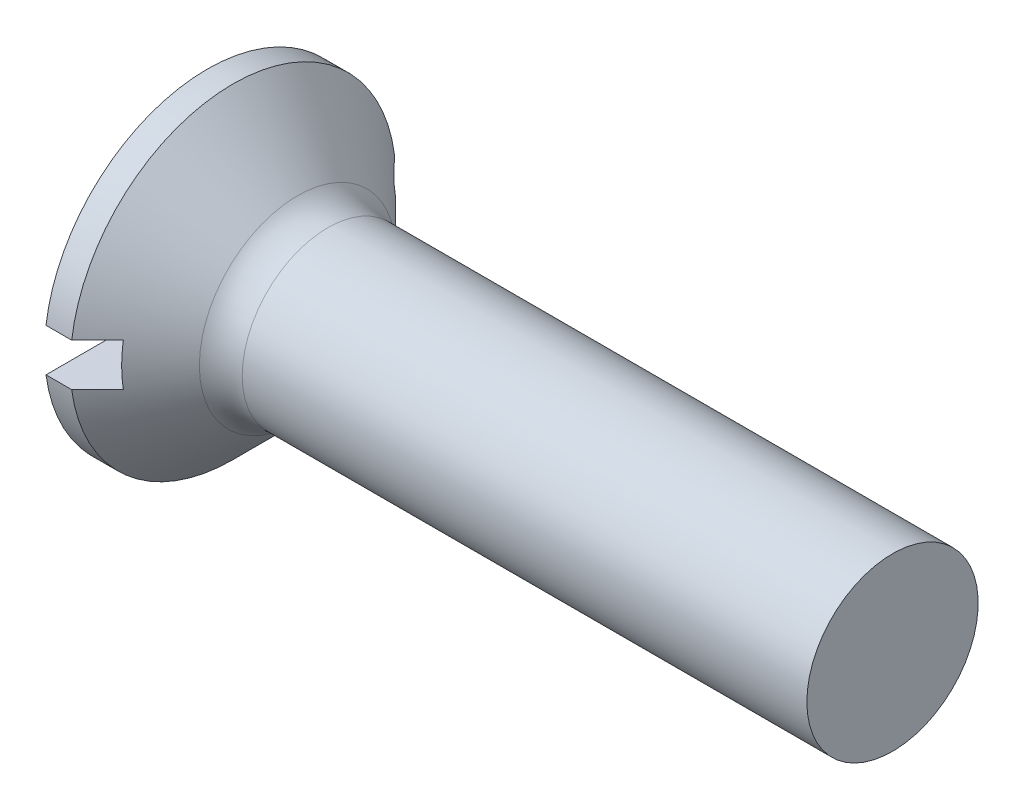
ISO-10303-21;
HEADER;
FILE_DESCRIPTION(('STEP AP214'),'2;1');
FILE_NAME('part.step','',(''),(''),'','','');
FILE_SCHEMA(('AUTOMOTIVE_DESIGN { 1 0 10303 214 1 1 1 1 }'));
ENDSEC;
DATA;
#1=APPLICATION_CONTEXT('core data for automotive mechanical design processes');
#2=APPLICATION_PROTOCOL_DEFINITION('international standard','automotive_design',2000,#1);
#3=PRODUCT_CONTEXT('',#1,'mechanical');
#4=PRODUCT('Part','Part','',(#3));
#5=PRODUCT_RELATED_PRODUCT_CATEGORY('part','',(#4));
#6=PRODUCT_DEFINITION_FORMATION('','',#4);
#7=PRODUCT_DEFINITION_CONTEXT('part definition',#1,'design');
#8=PRODUCT_DEFINITION('design','',#6,#7);
#9=PRODUCT_DEFINITION_SHAPE('','',#8);
#10=(LENGTH_UNIT() NAMED_UNIT(*) SI_UNIT(.MILLI.,.METRE.));
#11=(NAMED_UNIT(*) PLANE_ANGLE_UNIT() SI_UNIT($,.RADIAN.));
#12=(NAMED_UNIT(*) SI_UNIT($,.STERADIAN.) SOLID_ANGLE_UNIT());
#13=UNCERTAINTY_MEASURE_WITH_UNIT(LENGTH_MEASURE(1.E-05),#10,'distance_accuracy_value','');
#14=(GEOMETRIC_REPRESENTATION_CONTEXT(3) GLOBAL_UNCERTAINTY_ASSIGNED_CONTEXT((#13)) GLOBAL_UNIT_ASSIGNED_CONTEXT((#10,
#11,#12)) REPRESENTATION_CONTEXT('',''));
#15=CARTESIAN_POINT('',(0.,0.,0.));
#16=DIRECTION('',(0.,0.,1.));
#17=DIRECTION('',(1.,0.,0.));
#18=AXIS2_PLACEMENT_3D('',#15,#16,#17);
#19=CARTESIAN_POINT('',(0.,0.,0.));
#20=DIRECTION('',(-1.,0.,0.));
#21=DIRECTION('',(0.,0.,1.));
#22=AXIS2_PLACEMENT_3D('',#19,#20,#21);
#23=PLANE('',#22);
#24=DIRECTION('',(0.,0.,-1.));
#25=VECTOR('',#24,1.);
#26=CARTESIAN_POINT('',(0.,0.25,1.9));
#27=LINE('',#26,#25);
#28=CARTESIAN_POINT('',(0.,0.25,1.88348082018374));
#29=VERTEX_POINT('',#28);
#30=CARTESIAN_POINT('',(0.,0.25,-1.88348082018374));
#31=VERTEX_POINT('',#30);
#32=EDGE_CURVE('E176',#29,#31,#27,.T.);
#33=ORIENTED_EDGE('',*,*,#32,.F.);
#34=CARTESIAN_POINT('',(0.,0.,0.));
#35=DIRECTION('',(-1.,0.,0.));
#36=DIRECTION('',(0.,0.,1.));
#37=AXIS2_PLACEMENT_3D('',#34,#35,#36);
#38=CIRCLE('',#37,1.9);
#39=EDGE_CURVE('E141',#29,#31,#38,.T.);
#40=ORIENTED_EDGE('',*,*,#39,.T.);
#41=EDGE_LOOP('',(#33,#40));
#42=FACE_BOUND('',#41,.T.);
#43=ADVANCED_FACE('F35',(#42),#23,.T.);
#44=CARTESIAN_POINT('',(-6.34999999999999,0.,0.));
#45=DIRECTION('',(-1.,0.,0.));
#46=DIRECTION('',(0.,0.,1.));
#47=AXIS2_PLACEMENT_3D('',#44,#45,#46);
#48=CYLINDRICAL_SURFACE('',#47,1.9);
#49=DIRECTION('',(-1.,0.,0.));
#50=VECTOR('',#49,1.);
#51=CARTESIAN_POINT('',(-6.34999999999999,0.25,-1.88348082018374));
#52=LINE('',#51,#50);
#53=CARTESIAN_POINT('',(0.299999999999989,0.25,-1.88348082018376));
#54=VERTEX_POINT('',#53);
#55=EDGE_CURVE('E63',#31,#54,#52,.F.);
#56=ORIENTED_EDGE('',*,*,#55,.F.);
#57=ORIENTED_EDGE('',*,*,#39,.F.);
#58=DIRECTION('',(-1.,0.,0.));
#59=VECTOR('',#58,1.);
#60=CARTESIAN_POINT('',(-6.34999999999999,0.25,1.88348082018374));
#61=LINE('',#60,#59);
#62=CARTESIAN_POINT('',(0.300000000000003,0.25,1.88348082018374));
#63=VERTEX_POINT('',#62);
#64=EDGE_CURVE('E182',#63,#29,#61,.T.);
#65=ORIENTED_EDGE('',*,*,#64,.F.);
#66=CARTESIAN_POINT('',(0.300000000000003,0.,0.));
#67=DIRECTION('',(-1.,0.,0.));
#68=DIRECTION('',(0.,0.,1.));
#69=AXIS2_PLACEMENT_3D('',#66,#67,#68);
#70=CIRCLE('',#69,1.9);
#71=EDGE_CURVE('E112',#63,#54,#70,.T.);
#72=ORIENTED_EDGE('',*,*,#71,.T.);
#73=EDGE_LOOP('',(#56,#57,#65,#72));
#74=FACE_BOUND('',#73,.T.);
#75=ADVANCED_FACE('F163',(#74),#48,.T.);
#76=DIRECTION('',(0.,0.,1.));
#77=VECTOR('',#76,1.);
#78=CARTESIAN_POINT('',(0.,-0.250000000000001,-1.9));
#79=LINE('',#78,#77);
#80=CARTESIAN_POINT('',(0.,-0.250000000000001,-1.88348082018374));
#81=VERTEX_POINT('',#80);
#82=CARTESIAN_POINT('',(0.,-0.250000000000001,1.88348082018374));
#83=VERTEX_POINT('',#82);
#84=EDGE_CURVE('E106',#81,#83,#79,.T.);
#85=ORIENTED_EDGE('',*,*,#84,.F.);
#86=EDGE_CURVE('E131',#81,#83,#38,.T.);
#87=ORIENTED_EDGE('',*,*,#86,.T.);
#88=EDGE_LOOP('',(#85,#87));
#89=FACE_BOUND('',#88,.T.);
#90=ADVANCED_FACE('F161',(#89),#23,.T.);
#91=DIRECTION('',(-1.,0.,0.));
#92=VECTOR('',#91,1.);
#93=CARTESIAN_POINT('',(-6.34999999999999,-0.250000000000001,1.88348082018374));
#94=LINE('',#93,#92);
#95=CARTESIAN_POINT('',(0.299999999999989,-0.250000000000001,1.88348082018376));
#96=VERTEX_POINT('',#95);
#97=EDGE_CURVE('E132',#83,#96,#94,.F.);
#98=ORIENTED_EDGE('',*,*,#97,.F.);
#99=ORIENTED_EDGE('',*,*,#86,.F.);
#100=DIRECTION('',(-1.,0.,0.));
#101=VECTOR('',#100,1.);
#102=CARTESIAN_POINT('',(-6.34999999999999,-0.250000000000001,-1.88348082018374));
#103=LINE('',#102,#101);
#104=CARTESIAN_POINT('',(0.300000000000003,-0.250000000000001,-1.88348082018374));
#105=VERTEX_POINT('',#104);
#106=EDGE_CURVE('E121',#105,#81,#103,.T.);
#107=ORIENTED_EDGE('',*,*,#106,.F.);
#108=EDGE_CURVE('E129',#105,#96,#70,.T.);
#109=ORIENTED_EDGE('',*,*,#108,.T.);
#110=EDGE_LOOP('',(#98,#99,#107,#109));
#111=FACE_BOUND('',#110,.T.);
#112=ADVANCED_FACE('F128',(#111),#48,.T.);
#113=CARTESIAN_POINT('',(0.300000000000003,0.,0.));
#114=DIRECTION('',(-1.,0.,0.));
#115=DIRECTION('',(0.,0.,1.));
#116=AXIS2_PLACEMENT_3D('',#113,#114,#115);
#117=CONICAL_SURFACE('',#116,1.9,0.78539816339745);
#118=CARTESIAN_POINT('',(-1.98729422630551,0.25,-4.17982451038935));
#119=CARTESIAN_POINT('',(-1.84470913533547,0.25,-4.03698256603225));
#120=CARTESIAN_POINT('',(-1.70213517655014,0.25,-3.89412950070456));
#121=CARTESIAN_POINT('',(-1.41702186757104,0.25,-3.60838492143172));
#122=CARTESIAN_POINT('',(-1.27448251787976,0.25,-3.46549340698522));
#123=CARTESIAN_POINT('',(-0.989410499152169,0.25,-3.17961533117565));
#124=CARTESIAN_POINT('',(-0.846877845892992,0.25,-3.03662875407935));
#125=CARTESIAN_POINT('',(-0.561891165052778,0.25,-2.75058105917093));
#126=CARTESIAN_POINT('',(-0.419437136443918,0.25,-2.60751994238315));
#127=CARTESIAN_POINT('',(-0.131064292348537,0.25,-2.3176668049941));
#128=CARTESIAN_POINT('',(0.0148513539907664,0.25,-2.17087163179214));
#129=CARTESIAN_POINT('',(0.306462720413094,0.25,-1.87705115433807));
#130=CARTESIAN_POINT('',(0.452158431570259,0.25,-1.73002584121432));
#131=CARTESIAN_POINT('',(0.670327706151663,0.25,-1.50914686476255));
#132=CARTESIAN_POINT('',(0.742981250797221,0.25,-1.43547100609828));
#133=CARTESIAN_POINT('',(0.888099107922326,0.25,-1.28793053976864));
#134=CARTESIAN_POINT('',(0.960563417404761,0.25,-1.21406592915002));
#135=CARTESIAN_POINT('',(1.10516444224742,0.25,-1.0660275832816));
#136=CARTESIAN_POINT('',(1.17730118131636,0.25,-0.991853871173734));
#137=CARTESIAN_POINT('',(1.32099236723619,0.25,-0.84294514457437));
#138=CARTESIAN_POINT('',(1.39254683400264,0.25,-0.768210149450102));
#139=CARTESIAN_POINT('',(1.4825658678815,0.25,-0.672500233502236));
#140=CARTESIAN_POINT('',(1.50165114242041,0.25,-0.652110555381362));
#141=CARTESIAN_POINT('',(1.53968572913894,0.25,-0.611204724741305));
#142=CARTESIAN_POINT('',(1.55863503934745,0.25,-0.590688570396564));
#143=CARTESIAN_POINT('',(1.61514621539087,0.25,-0.528993825768736));
#144=CARTESIAN_POINT('',(1.65245554131459,0.25,-0.487580016311415));
#145=CARTESIAN_POINT('',(1.71225207904246,0.25,-0.419002643341745));
#146=CARTESIAN_POINT('',(1.73514735441112,0.25,-0.392195572563958));
#147=CARTESIAN_POINT('',(1.78011117382062,0.25,-0.337713683602133));
#148=CARTESIAN_POINT('',(1.80217634783667,0.25,-0.310036023298933));
#149=CARTESIAN_POINT('',(1.83405852164685,0.25,-0.26739675000213));
#150=CARTESIAN_POINT('',(1.84452887870795,0.25,-0.252926956129676));
#151=CARTESIAN_POINT('',(1.86480829380391,0.25,-0.223534103212474));
#152=CARTESIAN_POINT('',(1.87461759974615,0.25,-0.208611217166218));
#153=CARTESIAN_POINT('',(1.8932192565572,0.25,-0.178209466122465));
#154=CARTESIAN_POINT('',(1.90201523879352,0.25,-0.162732864604354));
#155=CARTESIAN_POINT('',(1.91807920679254,0.25,-0.13101950257968));
#156=CARTESIAN_POINT('',(1.92535000548919,0.25,-0.114784210217757));
#157=CARTESIAN_POINT('',(1.93762411485741,0.25,-0.0811668178626109));
#158=CARTESIAN_POINT('',(1.94259388017706,0.25,-0.063771739928644));
#159=CARTESIAN_POINT('',(1.94897989324943,0.25,-0.0284090713434214));
#160=CARTESIAN_POINT('',(1.95042002284216,0.25,-0.0104461659975856));
#161=CARTESIAN_POINT('',(1.94935644177881,0.25,0.0253992115742553));
#162=CARTESIAN_POINT('',(1.94684232540985,0.25,0.0432813469747596));
#163=CARTESIAN_POINT('',(1.93857592035239,0.25,0.0783510961631234));
#164=CARTESIAN_POINT('',(1.93280079704993,0.25,0.0955328861954527));
#165=CARTESIAN_POINT('',(1.91770670146767,0.25,0.13239784224318));
#166=CARTESIAN_POINT('',(1.9079044408816,0.25,0.151873654550218));
#167=CARTESIAN_POINT('',(1.88649113904698,0.25,0.189823155713473));
#168=CARTESIAN_POINT('',(1.87487561835218,0.25,0.208294205813897));
#169=CARTESIAN_POINT('',(1.85048324573877,0.25,0.244630361241057));
#170=CARTESIAN_POINT('',(1.83769879997766,0.25,0.262490290681415));
#171=CARTESIAN_POINT('',(1.81145322289458,0.25,0.297663877372688));
#172=CARTESIAN_POINT('',(1.79799297686919,0.25,0.314978203315155));
#173=CARTESIAN_POINT('',(1.75268964976738,0.25,0.371705919805397));
#174=CARTESIAN_POINT('',(1.71987651897858,0.25,0.410338972117884));
#175=CARTESIAN_POINT('',(1.65317458420771,0.25,0.486669402340337));
#176=CARTESIAN_POINT('',(1.61928533509996,0.25,0.524366381254672));
#177=CARTESIAN_POINT('',(1.55085976422305,0.25,0.599263041541323));
#178=CARTESIAN_POINT('',(1.51632262726528,0.25,0.636461979186223));
#179=CARTESIAN_POINT('',(1.44689518246044,0.25,0.710513545392871));
#180=CARTESIAN_POINT('',(1.41200494274365,0.25,0.747366238211863));
#181=CARTESIAN_POINT('',(1.30742637842109,0.25,0.857140556571603));
#182=CARTESIAN_POINT('',(1.23740074911625,0.25,0.929740569735702));
#183=CARTESIAN_POINT('',(1.09696472004179,0.25,1.07446651412946));
#184=CARTESIAN_POINT('',(1.02655462439956,0.25,1.14659274200916));
#185=CARTESIAN_POINT('',(0.834911887632562,0.25,1.3422369404478));
#186=CARTESIAN_POINT('',(0.713439687475853,0.25,1.46552022087721));
#187=CARTESIAN_POINT('',(0.470171078890065,0.25,1.71176788410888));
#188=CARTESIAN_POINT('',(0.34837466740016,0.25,1.83473226387866));
#189=CARTESIAN_POINT('',(-0.0173554901470557,0.25,2.20344593303904));
#190=CARTESIAN_POINT('',(-0.261551044831605,0.25,2.44893553827728));
#191=CARTESIAN_POINT('',(-0.752635037725528,0.25,2.94211353931879));
#192=CARTESIAN_POINT('',(-0.999526011157529,0.25,3.18979940617476));
#193=CARTESIAN_POINT('',(-1.49336982157244,0.25,3.68493789949824));
#194=CARTESIAN_POINT('',(-1.74032260728228,0.25,3.9323905770972));
#195=CARTESIAN_POINT('',(-1.98729422630551,0.25,4.17982451038934));
#196=B_SPLINE_CURVE_WITH_KNOTS('',3,(#118,#119,#120,#121,#122,#123,#124,#125,#126,#127,#128,
#129,#130,#131,#132,#133,#134,#135,#136,#137,#138,#139,#140,#141,#142,#143,#144,#145,#146,#147,
#148,#149,#150,#151,#152,#153,#154,#155,#156,#157,#158,#159,#160,#161,#162,#163,#164,#165,#166,
#167,#168,#169,#170,#171,#172,#173,#174,#175,#176,#177,#178,#179,#180,#181,#182,#183,#184,#185,
#186,#187,#188,#189,#190,#191,#192,#193,#194,#195),.UNSPECIFIED.,.F.,.F.,(4,2,2,2,2,2,2,2,2,2,2,
2,2,2,2,2,2,2,2,2,2,2,2,2,2,2,2,2,2,2,2,2,2,2,2,2,2,2,4),(0.,0.605482431225346,1.21097318233229,
1.81665168711006,2.42232207714462,3.04325825770119,3.66421899502984,3.9746379866888,
4.28506186531045,4.59546290620963,4.90585328539815,4.98963728022583,5.0734224872371,
5.24062546089035,5.34637861192141,5.45252280357737,5.50609279605942,5.55964258562074,
5.61299407520157,5.66624628494618,5.72025211290859,5.77389151113381,5.82767229932756,
5.88183443280842,5.94707677036331,6.01248290927082,6.07834909802315,6.14413114583103,
6.29613571362599,6.44820399733714,6.60047850521135,6.75272417196467,7.0553230067041,
7.35770972427607,7.87692671428236,8.39614862363949,9.43493043579255,10.4840877501042,
11.5328806536616),.UNSPECIFIED.);
#197=CARTESIAN_POINT('',(0.6,0.25,-1.58034806292791));
#198=VERTEX_POINT('',#197);
#199=EDGE_CURVE('E11',#54,#198,#196,.T.);
#200=ORIENTED_EDGE('',*,*,#199,.F.);
#201=ORIENTED_EDGE('',*,*,#71,.F.);
#202=CARTESIAN_POINT('',(0.6,0.25,1.58034806292791));
#203=VERTEX_POINT('',#202);
#204=EDGE_CURVE('E39',#203,#63,#196,.T.);
#205=ORIENTED_EDGE('',*,*,#204,.F.);
#206=CARTESIAN_POINT('',(0.6,0.,0.));
#207=DIRECTION('',(-1.,0.,0.));
#208=DIRECTION('',(0.,0.,1.));
#209=AXIS2_PLACEMENT_3D('',#206,#207,#208);
#210=CIRCLE('',#209,1.6);
#211=CARTESIAN_POINT('',(0.6,-0.250000000000001,1.58034806292791));
#212=VERTEX_POINT('',#211);
#213=EDGE_CURVE('E92',#203,#212,#210,.F.);
#214=ORIENTED_EDGE('',*,*,#213,.T.);
#215=CARTESIAN_POINT('',(-1.98729422630551,-0.250000000000001,4.17982451038935));
#216=CARTESIAN_POINT('',(-1.84470913533547,-0.250000000000001,4.03698256603225));
#217=CARTESIAN_POINT('',(-1.70213517655014,-0.250000000000001,3.89412950070456));
#218=CARTESIAN_POINT('',(-1.41702186757104,-0.250000000000001,3.60838492143172));
#219=CARTESIAN_POINT('',(-1.27448251787976,-0.250000000000001,3.46549340698522));
#220=CARTESIAN_POINT('',(-0.989410499152169,-0.250000000000001,3.17961533117565));
#221=CARTESIAN_POINT('',(-0.846877845892993,-0.250000000000001,3.03662875407935));
#222=CARTESIAN_POINT('',(-0.56189116505278,-0.250000000000001,2.75058105917093));
#223=CARTESIAN_POINT('',(-0.419437136443919,-0.250000000000001,2.60751994238315));
#224=CARTESIAN_POINT('',(-0.131064292348538,-0.250000000000001,2.3176668049941));
#225=CARTESIAN_POINT('',(0.0148513539907651,-0.250000000000001,2.17087163179215));
#226=CARTESIAN_POINT('',(0.306462720413092,-0.250000000000001,1.87705115433807));
#227=CARTESIAN_POINT('',(0.452158431570258,-0.250000000000001,1.73002584121432));
#228=CARTESIAN_POINT('',(0.670327706151662,-0.250000000000001,1.50914686476255));
#229=CARTESIAN_POINT('',(0.74298125079722,-0.250000000000001,1.43547100609828));
#230=CARTESIAN_POINT('',(0.888099107922325,-0.250000000000001,1.28793053976864));
#231=CARTESIAN_POINT('',(0.960563417404761,-0.250000000000001,1.21406592915002));
#232=CARTESIAN_POINT('',(1.10516444224742,-0.250000000000001,1.0660275832816));
#233=CARTESIAN_POINT('',(1.17730118131636,-0.250000000000001,0.991853871173734));
#234=CARTESIAN_POINT('',(1.32099236723619,-0.250000000000001,0.84294514457437));
#235=CARTESIAN_POINT('',(1.39254683400264,-0.250000000000001,0.768210149450102));
#236=CARTESIAN_POINT('',(1.4825658678815,-0.250000000000001,0.672500233502236));
#237=CARTESIAN_POINT('',(1.50165114242041,-0.250000000000001,0.652110555381362));
#238=CARTESIAN_POINT('',(1.53968572913894,-0.250000000000001,0.611204724741305));
#239=CARTESIAN_POINT('',(1.55863503934745,-0.250000000000001,0.590688570396564));
#240=CARTESIAN_POINT('',(1.61514621539087,-0.250000000000001,0.528993825768736));
#241=CARTESIAN_POINT('',(1.65245554131459,-0.250000000000001,0.487580016311415));
#242=CARTESIAN_POINT('',(1.71225207904246,-0.250000000000001,0.419002643341745));
#243=CARTESIAN_POINT('',(1.73514735441111,-0.250000000000001,0.392195572563957));
#244=CARTESIAN_POINT('',(1.78011117382062,-0.250000000000001,0.337713683602133));
#245=CARTESIAN_POINT('',(1.80217634783667,-0.250000000000001,0.310036023298933));
#246=CARTESIAN_POINT('',(1.83405852164685,-0.250000000000001,0.26739675000213));
#247=CARTESIAN_POINT('',(1.84452887870795,-0.250000000000001,0.252926956129675));
#248=CARTESIAN_POINT('',(1.86480829380391,-0.250000000000001,0.223534103212473));
#249=CARTESIAN_POINT('',(1.87461759974615,-0.250000000000001,0.208611217166217));
#250=CARTESIAN_POINT('',(1.8932192565572,-0.250000000000001,0.178209466122464));
#251=CARTESIAN_POINT('',(1.90201523879352,-0.250000000000001,0.162732864604353));
#252=CARTESIAN_POINT('',(1.91807920679254,-0.250000000000001,0.131019502579679));
#253=CARTESIAN_POINT('',(1.92535000548919,-0.250000000000001,0.114784210217756));
#254=CARTESIAN_POINT('',(1.93762411485741,-0.250000000000001,0.0811668178626096));
#255=CARTESIAN_POINT('',(1.94259388017706,-0.250000000000001,0.0637717399286428));
#256=CARTESIAN_POINT('',(1.94897989324943,-0.250000000000001,0.0284090713434201));
#257=CARTESIAN_POINT('',(1.95042002284216,-0.250000000000001,0.0104461659975843));
#258=CARTESIAN_POINT('',(1.94935644177881,-0.250000000000001,-0.0253992115742565));
#259=CARTESIAN_POINT('',(1.94684232540985,-0.250000000000001,-0.0432813469747608));
#260=CARTESIAN_POINT('',(1.93857592035239,-0.250000000000001,-0.0783510961631245));
#261=CARTESIAN_POINT('',(1.93280079704993,-0.250000000000001,-0.0955328861954537));
#262=CARTESIAN_POINT('',(1.91770670146766,-0.250000000000001,-0.132397842243181));
#263=CARTESIAN_POINT('',(1.9079044408816,-0.250000000000001,-0.15187365455022));
#264=CARTESIAN_POINT('',(1.88649113904698,-0.250000000000001,-0.189823155713475));
#265=CARTESIAN_POINT('',(1.87487561835218,-0.250000000000001,-0.208294205813898));
#266=CARTESIAN_POINT('',(1.85048324573876,-0.250000000000001,-0.244630361241059));
#267=CARTESIAN_POINT('',(1.83769879997766,-0.250000000000001,-0.262490290681418));
#268=CARTESIAN_POINT('',(1.81145322289457,-0.250000000000001,-0.29766387737269));
#269=CARTESIAN_POINT('',(1.79799297686919,-0.250000000000001,-0.314978203315158));
#270=CARTESIAN_POINT('',(1.75268964976738,-0.250000000000001,-0.3717059198054));
#271=CARTESIAN_POINT('',(1.71987651897858,-0.250000000000001,-0.410338972117888));
#272=CARTESIAN_POINT('',(1.6531745842077,-0.250000000000001,-0.486669402340342));
#273=CARTESIAN_POINT('',(1.61928533509996,-0.250000000000001,-0.524366381254677));
#274=CARTESIAN_POINT('',(1.55085976422304,-0.250000000000001,-0.599263041541329));
#275=CARTESIAN_POINT('',(1.51632262726528,-0.250000000000001,-0.636461979186229));
#276=CARTESIAN_POINT('',(1.44689518246043,-0.250000000000001,-0.710513545392877));
#277=CARTESIAN_POINT('',(1.41200494274364,-0.250000000000001,-0.74736623821187));
#278=CARTESIAN_POINT('',(1.30742637842108,-0.250000000000001,-0.857140556571611));
#279=CARTESIAN_POINT('',(1.23740074911624,-0.250000000000001,-0.92974056973571));
#280=CARTESIAN_POINT('',(1.09696472004178,-0.250000000000001,-1.07446651412947));
#281=CARTESIAN_POINT('',(1.02655462439955,-0.250000000000001,-1.14659274200917));
#282=CARTESIAN_POINT('',(0.83491188763255,-0.250000000000001,-1.34223694044781));
#283=CARTESIAN_POINT('',(0.713439687475841,-0.250000000000001,-1.46552022087722));
#284=CARTESIAN_POINT('',(0.470171078890054,-0.250000000000001,-1.71176788410889));
#285=CARTESIAN_POINT('',(0.348374667400149,-0.250000000000001,-1.83473226387867));
#286=CARTESIAN_POINT('',(-0.0173554901470656,-0.250000000000001,-2.20344593303905));
#287=CARTESIAN_POINT('',(-0.261551044831614,-0.250000000000001,-2.44893553827729));
#288=CARTESIAN_POINT('',(-0.752635037725536,-0.250000000000001,-2.9421135393188));
#289=CARTESIAN_POINT('',(-0.999526011157535,-0.250000000000001,-3.18979940617476));
#290=CARTESIAN_POINT('',(-1.49336982157245,-0.250000000000001,-3.68493789949824));
#291=CARTESIAN_POINT('',(-1.74032260728228,-0.250000000000001,-3.9323905770972));
#292=CARTESIAN_POINT('',(-1.98729422630551,-0.250000000000001,-4.17982451038935));
#293=B_SPLINE_CURVE_WITH_KNOTS('',3,(#215,#216,#217,#218,#219,#220,#221,#222,#223,#224,#225,
#226,#227,#228,#229,#230,#231,#232,#233,#234,#235,#236,#237,#238,#239,#240,#241,#242,#243,#244,
#245,#246,#247,#248,#249,#250,#251,#252,#253,#254,#255,#256,#257,#258,#259,#260,#261,#262,#263,
#264,#265,#266,#267,#268,#269,#270,#271,#272,#273,#274,#275,#276,#277,#278,#279,#280,#281,#282,
#283,#284,#285,#286,#287,#288,#289,#290,#291,#292),.UNSPECIFIED.,.F.,.F.,(4,2,2,2,2,2,2,2,2,2,2,
2,2,2,2,2,2,2,2,2,2,2,2,2,2,2,2,2,2,2,2,2,2,2,2,2,2,2,4),(0.,0.605482431225346,1.21097318233229,
1.81665168711006,2.42232207714462,3.04325825770119,3.66421899502984,3.9746379866888,
4.28506186531045,4.59546290620963,4.90585328539815,4.98963728022583,5.0734224872371,
5.24062546089035,5.34637861192141,5.45252280357737,5.50609279605942,5.55964258562074,
5.61299407520157,5.66624628494618,5.72025211290859,5.77389151113381,5.82767229932756,
5.88183443280842,5.94707677036331,6.01248290927082,6.07834909802315,6.14413114583103,
6.29613571362599,6.44820399733714,6.60047850521136,6.75272417196468,7.05532300670411,
7.35770972427609,7.87692671428238,8.3961486236395,9.43493043579256,10.4840877501042,
11.5328806536615),.UNSPECIFIED.);
#294=EDGE_CURVE('E100',#96,#212,#293,.T.);
#295=ORIENTED_EDGE('',*,*,#294,.F.);
#296=ORIENTED_EDGE('',*,*,#108,.F.);
#297=CARTESIAN_POINT('',(0.6,-0.250000000000001,-1.58034806292791));
#298=VERTEX_POINT('',#297);
#299=EDGE_CURVE('E49',#298,#105,#293,.T.);
#300=ORIENTED_EDGE('',*,*,#299,.F.);
#301=EDGE_CURVE('E103',#298,#198,#210,.F.);
#302=ORIENTED_EDGE('',*,*,#301,.T.);
#303=EDGE_LOOP('',(#200,#201,#205,#214,#295,#296,#300,#302));
#304=FACE_BOUND('',#303,.T.);
#305=CARTESIAN_POINT('',(1.05355339059327,0.,0.));
#306=DIRECTION('',(-1.,0.,0.));
#307=DIRECTION('',(0.,0.,1.));
#308=AXIS2_PLACEMENT_3D('',#305,#306,#307);
#309=CIRCLE('',#308,1.14644660940673);
#310=CARTESIAN_POINT('',(1.05355339059327,0.,1.14644660940673));
#311=VERTEX_POINT('',#310);
#312=EDGE_CURVE('E142',#311,#311,#309,.T.);
#313=ORIENTED_EDGE('',*,*,#312,.T.);
#314=EDGE_LOOP('',(#313));
#315=FACE_BOUND('',#314,.T.);
#316=ADVANCED_FACE('F109',(#304,#315),#117,.T.);
#317=CARTESIAN_POINT('',(-6.34999999999999,0.,0.));
#318=DIRECTION('',(-1.,0.,0.));
#319=DIRECTION('',(0.,0.,1.));
#320=AXIS2_PLACEMENT_3D('',#317,#318,#319);
#321=CYLINDRICAL_SURFACE('',#320,1.);
#322=CARTESIAN_POINT('',(1.40710678118655,0.,0.));
#323=DIRECTION('',(-1.,0.,0.));
#324=DIRECTION('',(0.,0.,1.));
#325=AXIS2_PLACEMENT_3D('',#322,#323,#324);
#326=CIRCLE('',#325,1.);
#327=CARTESIAN_POINT('',(1.40710678118655,0.,1.));
#328=VERTEX_POINT('',#327);
#329=EDGE_CURVE('E101',#328,#328,#326,.F.);
#330=ORIENTED_EDGE('',*,*,#329,.T.);
#331=EDGE_LOOP('',(#330));
#332=FACE_BOUND('',#331,.T.);
#333=CARTESIAN_POINT('',(8.,0.,0.));
#334=DIRECTION('',(-1.,0.,0.));
#335=DIRECTION('',(0.,0.,1.));
#336=AXIS2_PLACEMENT_3D('',#333,#334,#335);
#337=CIRCLE('',#336,1.);
#338=CARTESIAN_POINT('',(8.,0.,1.));
#339=VERTEX_POINT('',#338);
#340=EDGE_CURVE('E134',#339,#339,#337,.T.);
#341=ORIENTED_EDGE('',*,*,#340,.T.);
#342=EDGE_LOOP('',(#341));
#343=FACE_BOUND('',#342,.T.);
#344=ADVANCED_FACE('F148',(#332,#343),#321,.T.);
#345=CARTESIAN_POINT('',(8.,1.,0.));
#346=DIRECTION('',(1.,0.,0.));
#347=DIRECTION('',(0.,0.,-1.));
#348=AXIS2_PLACEMENT_3D('',#345,#346,#347);
#349=PLANE('',#348);
#350=ORIENTED_EDGE('',*,*,#340,.F.);
#351=EDGE_LOOP('',(#350));
#352=FACE_BOUND('',#351,.T.);
#353=ADVANCED_FACE('F153',(#352),#349,.T.);
#354=CARTESIAN_POINT('',(1.40710678118655,0.,0.));
#355=DIRECTION('',(-1.,0.,0.));
#356=DIRECTION('',(0.,0.,1.));
#357=AXIS2_PLACEMENT_3D('',#354,#355,#356);
#358=TOROIDAL_SURFACE('',#357,1.5,0.5);
#359=ORIENTED_EDGE('',*,*,#329,.F.);
#360=EDGE_LOOP('',(#359));
#361=FACE_BOUND('',#360,.T.);
#362=ORIENTED_EDGE('',*,*,#312,.F.);
#363=EDGE_LOOP('',(#362));
#364=FACE_BOUND('',#363,.T.);
#365=ADVANCED_FACE('F37',(#361,#364),#358,.F.);
#366=CARTESIAN_POINT('',(0.6,0.25,1.9));
#367=DIRECTION('',(0.,1.,0.));
#368=DIRECTION('',(0.,0.,1.));
#369=AXIS2_PLACEMENT_3D('',#366,#367,#368);
#370=PLANE('',#369);
#371=ORIENTED_EDGE('',*,*,#55,.T.);
#372=ORIENTED_EDGE('',*,*,#199,.T.);
#373=DIRECTION('',(0.,0.,-1.));
#374=VECTOR('',#373,1.);
#375=CARTESIAN_POINT('',(0.6,0.25,1.9));
#376=LINE('',#375,#374);
#377=EDGE_CURVE('E95',#203,#198,#376,.T.);
#378=ORIENTED_EDGE('',*,*,#377,.F.);
#379=ORIENTED_EDGE('',*,*,#204,.T.);
#380=ORIENTED_EDGE('',*,*,#64,.T.);
#381=ORIENTED_EDGE('',*,*,#32,.T.);
#382=EDGE_LOOP('',(#371,#372,#378,#379,#380,#381));
#383=FACE_BOUND('',#382,.T.);
#384=ADVANCED_FACE('F104',(#383),#370,.F.);
#385=CARTESIAN_POINT('',(0.6,-0.250000000000001,-1.9));
#386=DIRECTION('',(0.,-1.,0.));
#387=DIRECTION('',(0.,0.,-1.));
#388=AXIS2_PLACEMENT_3D('',#385,#386,#387);
#389=PLANE('',#388);
#390=ORIENTED_EDGE('',*,*,#97,.T.);
#391=ORIENTED_EDGE('',*,*,#294,.T.);
#392=DIRECTION('',(0.,0.,1.));
#393=VECTOR('',#392,1.);
#394=CARTESIAN_POINT('',(0.6,-0.250000000000001,-1.9));
#395=LINE('',#394,#393);
#396=EDGE_CURVE('E56',#298,#212,#395,.T.);
#397=ORIENTED_EDGE('',*,*,#396,.F.);
#398=ORIENTED_EDGE('',*,*,#299,.T.);
#399=ORIENTED_EDGE('',*,*,#106,.T.);
#400=ORIENTED_EDGE('',*,*,#84,.T.);
#401=EDGE_LOOP('',(#390,#391,#397,#398,#399,#400));
#402=FACE_BOUND('',#401,.T.);
#403=ADVANCED_FACE('F120',(#402),#389,.F.);
#404=CARTESIAN_POINT('',(0.6,0.25,-1.9));
#405=DIRECTION('',(-1.,0.,0.));
#406=DIRECTION('',(0.,0.,1.));
#407=AXIS2_PLACEMENT_3D('',#404,#405,#406);
#408=PLANE('',#407);
#409=ORIENTED_EDGE('',*,*,#396,.T.);
#410=ORIENTED_EDGE('',*,*,#213,.F.);
#411=ORIENTED_EDGE('',*,*,#377,.T.);
#412=ORIENTED_EDGE('',*,*,#301,.F.);
#413=EDGE_LOOP('',(#409,#410,#411,#412));
#414=FACE_BOUND('',#413,.T.);
#415=ADVANCED_FACE('F94',(#414),#408,.T.);
#416=CLOSED_SHELL('',(#43,#75,#90,#112,#316,#344,#353,#365,#384,#403,#415));
#417=MANIFOLD_SOLID_BREP('B2',#416);
#418=ADVANCED_BREP_SHAPE_REPRESENTATION('',(#18,#417),#14);
#419=SHAPE_DEFINITION_REPRESENTATION(#9,#418);
ENDSEC;
END-ISO-10303-21;
